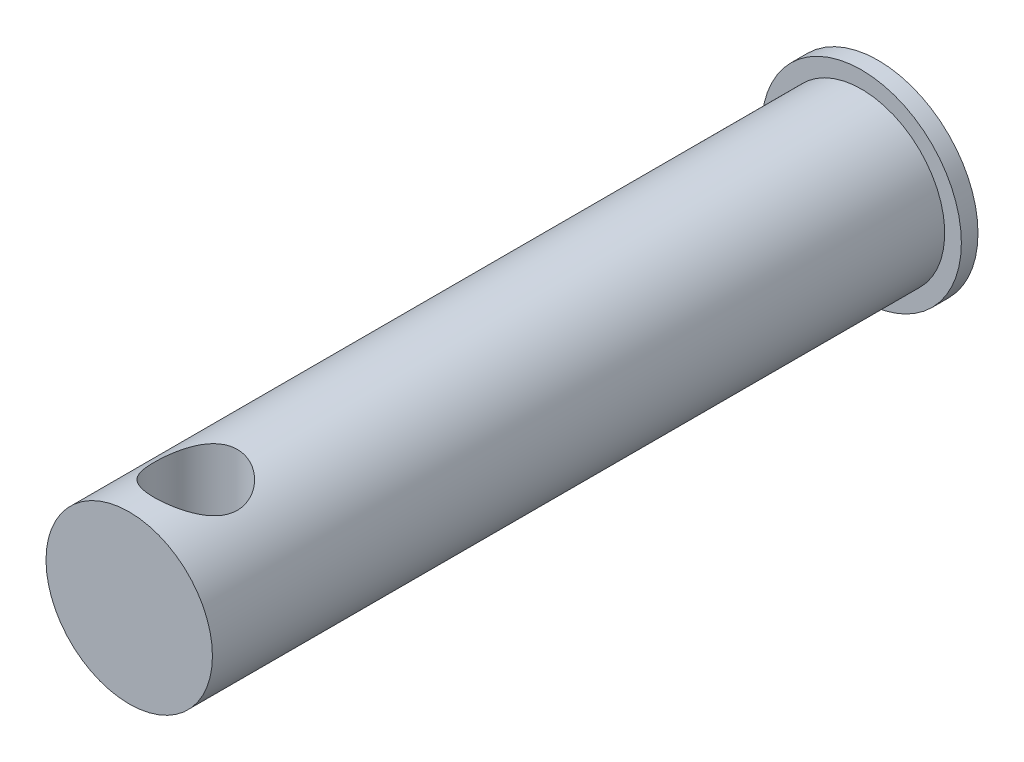
ISO-10303-21;
HEADER;
FILE_DESCRIPTION(('STEP AP214'),'2;1');
FILE_NAME('part.step','',(''),(''),'','','');
FILE_SCHEMA(('AUTOMOTIVE_DESIGN { 1 0 10303 214 1 1 1 1 }'));
ENDSEC;
DATA;
#1=APPLICATION_CONTEXT('core data for automotive mechanical design processes');
#2=APPLICATION_PROTOCOL_DEFINITION('international standard','automotive_design',2000,#1);
#3=PRODUCT_CONTEXT('',#1,'mechanical');
#4=PRODUCT('Part','Part','',(#3));
#5=PRODUCT_RELATED_PRODUCT_CATEGORY('part','',(#4));
#6=PRODUCT_DEFINITION_FORMATION('','',#4);
#7=PRODUCT_DEFINITION_CONTEXT('part definition',#1,'design');
#8=PRODUCT_DEFINITION('design','',#6,#7);
#9=PRODUCT_DEFINITION_SHAPE('','',#8);
#10=(LENGTH_UNIT() NAMED_UNIT(*) SI_UNIT(.MILLI.,.METRE.));
#11=(NAMED_UNIT(*) PLANE_ANGLE_UNIT() SI_UNIT($,.RADIAN.));
#12=(NAMED_UNIT(*) SI_UNIT($,.STERADIAN.) SOLID_ANGLE_UNIT());
#13=UNCERTAINTY_MEASURE_WITH_UNIT(LENGTH_MEASURE(1.E-05),#10,'distance_accuracy_value','');
#14=(GEOMETRIC_REPRESENTATION_CONTEXT(3) GLOBAL_UNCERTAINTY_ASSIGNED_CONTEXT((#13)) GLOBAL_UNIT_ASSIGNED_CONTEXT((#10,
#11,#12)) REPRESENTATION_CONTEXT('',''));
#15=CARTESIAN_POINT('',(0.,0.,0.));
#16=DIRECTION('',(0.,0.,1.));
#17=DIRECTION('',(1.,0.,0.));
#18=AXIS2_PLACEMENT_3D('',#15,#16,#17);
#19=CARTESIAN_POINT('',(0.,0.,5.715));
#20=DIRECTION('',(0.,0.,-1.));
#21=DIRECTION('',(-1.,0.,0.));
#22=AXIS2_PLACEMENT_3D('',#19,#20,#21);
#23=CYLINDRICAL_SURFACE('',#22,1.27);
#24=CARTESIAN_POINT('',(0.,0.,5.715));
#25=DIRECTION('',(0.,0.,1.));
#26=DIRECTION('',(1.,0.,0.));
#27=AXIS2_PLACEMENT_3D('',#24,#25,#26);
#28=CIRCLE('',#27,1.27);
#29=CARTESIAN_POINT('',(1.27,0.,5.715));
#30=VERTEX_POINT('',#29);
#31=EDGE_CURVE('E41',#30,#30,#28,.T.);
#32=ORIENTED_EDGE('',*,*,#31,.F.);
#33=EDGE_LOOP('',(#32));
#34=FACE_BOUND('',#33,.T.);
#35=CARTESIAN_POINT('',(0.,1.27,5.334));
#36=CARTESIAN_POINT('',(-0.0333831964751464,1.26999818011636,5.33399790302712));
#37=CARTESIAN_POINT('',(-0.0668061908082507,1.26866961797394,5.33135200356774));
#38=CARTESIAN_POINT('',(-0.13266434939545,1.26348589083747,5.32088542098352));
#39=CARTESIAN_POINT('',(-0.165097515063075,1.25962592771405,5.31305491044649));
#40=CARTESIAN_POINT('',(-0.227922800999165,1.24978337421103,5.29260193152834));
#41=CARTESIAN_POINT('',(-0.25832231986638,1.24380903877725,5.27999808600251));
#42=CARTESIAN_POINT('',(-0.316530111672169,1.23028568087519,5.25045265543326));
#43=CARTESIAN_POINT('',(-0.344338588683682,1.22273678257291,5.23351141240198));
#44=CARTESIAN_POINT('',(-0.398467464278819,1.20622223993866,5.19460654657684));
#45=CARTESIAN_POINT('',(-0.424596059062541,1.19719851445985,5.17240108568283));
#46=CARTESIAN_POINT('',(-0.472934947490531,1.17894081106683,5.12411886067813));
#47=CARTESIAN_POINT('',(-0.495142255272797,1.16970667892737,5.0980391741245));
#48=CARTESIAN_POINT('',(-0.536735020285927,1.15124834010315,5.04032307305265));
#49=CARTESIAN_POINT('',(-0.55576808807529,1.14208043726034,5.00841257755035));
#50=CARTESIAN_POINT('',(-0.588116824075592,1.12576596520424,4.94133674164875));
#51=CARTESIAN_POINT('',(-0.601436576503622,1.11861795330438,4.90617374826105));
#52=CARTESIAN_POINT('',(-0.621114100789754,1.10780745569008,4.83573765805708));
#53=CARTESIAN_POINT('',(-0.627840919246081,1.10396192455658,4.8005971729372));
#54=CARTESIAN_POINT('',(-0.635271140751118,1.09970500117315,4.72949343801003));
#55=CARTESIAN_POINT('',(-0.635980496116903,1.09929021532988,4.69353103654681));
#56=CARTESIAN_POINT('',(-0.631626427354407,1.10179440713353,4.62642837455974));
#57=CARTESIAN_POINT('',(-0.627243195305882,1.10432064925379,4.59522574017336));
#58=CARTESIAN_POINT('',(-0.614006804151152,1.11173405245995,4.53407658754812));
#59=CARTESIAN_POINT('',(-0.605152221175009,1.11662196558178,4.50413047273112));
#60=CARTESIAN_POINT('',(-0.583063210545113,1.12831547522091,4.44548950082081));
#61=CARTESIAN_POINT('',(-0.569731567618657,1.13516308821639,4.41684003677102));
#62=CARTESIAN_POINT('',(-0.539141471669182,1.15000661718691,4.36204722420534));
#63=CARTESIAN_POINT('',(-0.521881254820917,1.15800304835421,4.33590500889394));
#64=CARTESIAN_POINT('',(-0.481371944869621,1.17546855268586,4.28337900450805));
#65=CARTESIAN_POINT('',(-0.457640981064494,1.18499579000334,4.25738488527914));
#66=CARTESIAN_POINT('',(-0.406117792500773,1.20362740795759,4.20958300919478));
#67=CARTESIAN_POINT('',(-0.378323637924672,1.21273158493839,4.18777725305848));
#68=CARTESIAN_POINT('',(-0.317827981203224,1.23000761924682,4.14801960524612));
#69=CARTESIAN_POINT('',(-0.284958530665625,1.23811654942875,4.13029369999695));
#70=CARTESIAN_POINT('',(-0.216196046835387,1.25195254511989,4.10076838655769));
#71=CARTESIAN_POINT('',(-0.180305440928451,1.25768150129156,4.08896427251537));
#72=CARTESIAN_POINT('',(-0.109706722204546,1.26570951925812,4.07258811863991));
#73=CARTESIAN_POINT('',(-0.0751468718981862,1.26825335821333,4.0674980653008));
#74=CARTESIAN_POINT('',(-0.00557504596783976,1.2704636354653,4.0630698957296));
#75=CARTESIAN_POINT('',(0.0294367076173873,1.27013143688033,4.06372905461893));
#76=CARTESIAN_POINT('',(0.096032937211106,1.26676907080935,4.07048124714591));
#77=CARTESIAN_POINT('',(0.127672724111721,1.26395001012,4.07614915828357));
#78=CARTESIAN_POINT('',(0.189488376611717,1.2561707878491,4.09209117565338));
#79=CARTESIAN_POINT('',(0.219664080413783,1.25121039022301,4.10236578969788));
#80=CARTESIAN_POINT('',(0.278694266365538,1.2394199964768,4.12749902618506));
#81=CARTESIAN_POINT('',(0.307486302098908,1.23254059923911,4.14248031682417));
#82=CARTESIAN_POINT('',(0.362242964678815,1.21757423691364,4.17646328513524));
#83=CARTESIAN_POINT('',(0.388206379907304,1.20948675784274,4.19546667546683));
#84=CARTESIAN_POINT('',(0.439272482699565,1.1919472054929,4.23910787008637));
#85=CARTESIAN_POINT('',(0.464040269418646,1.1824391187876,4.26411572146801));
#86=CARTESIAN_POINT('',(0.509178763906908,1.1637161866846,4.31795247105601));
#87=CARTESIAN_POINT('',(0.529546429913685,1.15450154787269,4.3467839904484));
#88=CARTESIAN_POINT('',(0.566234525706037,1.13697507063553,4.4092137204172));
#89=CARTESIAN_POINT('',(0.582311189882935,1.12872856336305,4.44297515404246));
#90=CARTESIAN_POINT('',(0.608382594518765,1.1148953595376,4.51326889298475));
#91=CARTESIAN_POINT('',(0.618385171588607,1.10930523782792,4.54979755932825));
#92=CARTESIAN_POINT('',(0.631102171530546,1.10211553140503,4.62083799151702));
#93=CARTESIAN_POINT('',(0.634424052714549,1.10018438497412,4.65520675092744));
#94=CARTESIAN_POINT('',(0.6354376130318,1.09960000200321,4.72404888765341));
#95=CARTESIAN_POINT('',(0.633131732606494,1.10094534463496,4.75852221314954));
#96=CARTESIAN_POINT('',(0.623523089751088,1.10641042401766,4.82313202347283));
#97=CARTESIAN_POINT('',(0.616717279607678,1.1102536499632,4.85336879854169));
#98=CARTESIAN_POINT('',(0.59891635247265,1.11995595279328,4.91223815583469));
#99=CARTESIAN_POINT('',(0.58791988788648,1.12581567806744,4.9408702186284));
#100=CARTESIAN_POINT('',(0.561222998265935,1.13937116781475,4.99784678037649));
#101=CARTESIAN_POINT('',(0.545256172513452,1.14716383721581,5.02604271766186));
#102=CARTESIAN_POINT('',(0.509365866989263,1.16354435587965,5.07953933047467));
#103=CARTESIAN_POINT('',(0.489440328736542,1.17213261759521,5.10483848887924));
#104=CARTESIAN_POINT('',(0.443359112432048,1.19038575206164,5.15502015879709));
#105=CARTESIAN_POINT('',(0.416740608611459,1.20005464402783,5.17947852999982));
#106=CARTESIAN_POINT('',(0.359508301949878,1.21842372681981,5.22367699447401));
#107=CARTESIAN_POINT('',(0.328892359268059,1.22712339416105,5.24341454453569));
#108=CARTESIAN_POINT('',(0.264116563980667,1.24268236086541,5.277635090354));
#109=CARTESIAN_POINT('',(0.229933184998481,1.24952821317447,5.29207994757626));
#110=CARTESIAN_POINT('',(0.159221234321812,1.26048351765801,5.31482818662854));
#111=CARTESIAN_POINT('',(0.122699652760711,1.26460074341812,5.32314902273678));
#112=CARTESIAN_POINT('',(0.0715022360169488,1.26806618312636,5.33012485603316));
#113=CARTESIAN_POINT('',(0.0572527934440815,1.26878946990393,5.3315759769484));
#114=CARTESIAN_POINT('',(0.0286713496975449,1.26975677580944,5.33351401260317));
#115=CARTESIAN_POINT('',(0.0143393462560871,1.2700007817089,5.33400090072921));
#116=CARTESIAN_POINT('',(0.,1.27,5.334));
#117=B_SPLINE_CURVE_WITH_KNOTS('',3,(#35,#36,#37,#38,#39,#40,#41,#42,#43,#44,#45,#46,#47,#48,
#49,#50,#51,#52,#53,#54,#55,#56,#57,#58,#59,#60,#61,#62,#63,#64,#65,#66,#67,#68,#69,#70,#71,#72,
#73,#74,#75,#76,#77,#78,#79,#80,#81,#82,#83,#84,#85,#86,#87,#88,#89,#90,#91,#92,#93,#94,#95,#96,
#97,#98,#99,#100,#101,#102,#103,#104,#105,#106,#107,#108,#109,#110,#111,#112,#113,#114,#115,
#116),.UNSPECIFIED.,.T.,.F.,(4,2,2,2,2,2,2,2,2,2,2,2,2,2,2,2,2,2,2,2,2,2,2,2,2,2,2,2,2,2,2,2,2,
2,2,2,2,2,2,2,4),(0.,0.100091403461886,0.200373075065341,0.30026746873761,0.400153987969296,
0.506083416785987,0.612093160910313,0.726323962835281,0.840472969154084,0.94778837709046,
1.05499761903928,1.14938627379919,1.24380500492806,1.3404230250699,1.43708451000241,
1.54600237747013,1.65497214470166,1.7690021910617,1.88294147739298,1.98744389449305,
2.09189678464787,2.18825385631388,2.28462155235642,2.38374463577716,2.48291001225196,
2.59181352759206,2.70079208770799,2.81504823171393,2.92915665082394,3.03231110261467,
3.13542083011104,3.22870785705056,3.32202490777636,3.42161150052515,3.52125001323238,
3.63299529147837,3.74480063444124,3.85739648675958,3.96967016976831,4.01266202887438,
4.05565507456928),.UNSPECIFIED.);
#118=CARTESIAN_POINT('',(0.,1.27,5.334));
#119=VERTEX_POINT('',#118);
#120=EDGE_CURVE('E50',#119,#119,#117,.T.);
#121=ORIENTED_EDGE('',*,*,#120,.T.);
#122=EDGE_LOOP('',(#121));
#123=FACE_BOUND('',#122,.T.);
#124=CARTESIAN_POINT('',(0.,-1.27,5.334));
#125=CARTESIAN_POINT('',(0.0333831964751464,-1.26999818011636,5.33399790302712));
#126=CARTESIAN_POINT('',(0.0668061908082507,-1.26866961797394,5.33135200356774));
#127=CARTESIAN_POINT('',(0.13266434939545,-1.26348589083747,5.32088542098352));
#128=CARTESIAN_POINT('',(0.165097515063075,-1.25962592771405,5.31305491044649));
#129=CARTESIAN_POINT('',(0.227922800999165,-1.24978337421103,5.29260193152834));
#130=CARTESIAN_POINT('',(0.25832231986638,-1.24380903877725,5.27999808600251));
#131=CARTESIAN_POINT('',(0.316530111672169,-1.23028568087519,5.25045265543326));
#132=CARTESIAN_POINT('',(0.344338588683682,-1.22273678257292,5.23351141240198));
#133=CARTESIAN_POINT('',(0.398467464278819,-1.20622223993866,5.19460654657684));
#134=CARTESIAN_POINT('',(0.424596059062541,-1.19719851445985,5.17240108568283));
#135=CARTESIAN_POINT('',(0.472934947490531,-1.17894081106683,5.12411886067813));
#136=CARTESIAN_POINT('',(0.495142255272797,-1.16970667892737,5.0980391741245));
#137=CARTESIAN_POINT('',(0.536735020285927,-1.15124834010315,5.04032307305265));
#138=CARTESIAN_POINT('',(0.55576808807529,-1.14208043726034,5.00841257755035));
#139=CARTESIAN_POINT('',(0.588116824075592,-1.12576596520424,4.94133674164875));
#140=CARTESIAN_POINT('',(0.601436576503622,-1.11861795330438,4.90617374826105));
#141=CARTESIAN_POINT('',(0.621114100789754,-1.10780745569008,4.83573765805708));
#142=CARTESIAN_POINT('',(0.627840919246081,-1.10396192455658,4.8005971729372));
#143=CARTESIAN_POINT('',(0.635271140751118,-1.09970500117315,4.72949343801003));
#144=CARTESIAN_POINT('',(0.635980496116903,-1.09929021532988,4.69353103654682));
#145=CARTESIAN_POINT('',(0.631626427354407,-1.10179440713353,4.62642837455974));
#146=CARTESIAN_POINT('',(0.627243195305882,-1.10432064925379,4.59522574017336));
#147=CARTESIAN_POINT('',(0.614006804151153,-1.11173405245995,4.53407658754812));
#148=CARTESIAN_POINT('',(0.605152221175009,-1.11662196558178,4.50413047273112));
#149=CARTESIAN_POINT('',(0.583063210545113,-1.12831547522091,4.44548950082081));
#150=CARTESIAN_POINT('',(0.569731567618657,-1.13516308821639,4.41684003677102));
#151=CARTESIAN_POINT('',(0.539141471669182,-1.15000661718691,4.36204722420534));
#152=CARTESIAN_POINT('',(0.521881254820917,-1.15800304835421,4.33590500889394));
#153=CARTESIAN_POINT('',(0.481371944869621,-1.17546855268586,4.28337900450805));
#154=CARTESIAN_POINT('',(0.457640981064494,-1.18499579000334,4.25738488527914));
#155=CARTESIAN_POINT('',(0.406117792500773,-1.20362740795759,4.20958300919478));
#156=CARTESIAN_POINT('',(0.378323637924672,-1.21273158493839,4.18777725305848));
#157=CARTESIAN_POINT('',(0.317827981203224,-1.23000761924682,4.14801960524612));
#158=CARTESIAN_POINT('',(0.284958530665625,-1.23811654942875,4.13029369999695));
#159=CARTESIAN_POINT('',(0.216196046835387,-1.25195254511989,4.10076838655769));
#160=CARTESIAN_POINT('',(0.180305440928451,-1.25768150129156,4.08896427251537));
#161=CARTESIAN_POINT('',(0.109706722204546,-1.26570951925812,4.07258811863991));
#162=CARTESIAN_POINT('',(0.0751468718981861,-1.26825335821333,4.0674980653008));
#163=CARTESIAN_POINT('',(0.0055750459678397,-1.2704636354653,4.0630698957296));
#164=CARTESIAN_POINT('',(-0.0294367076173873,-1.27013143688033,4.06372905461893));
#165=CARTESIAN_POINT('',(-0.096032937211106,-1.26676907080935,4.07048124714591));
#166=CARTESIAN_POINT('',(-0.127672724111721,-1.26395001012,4.07614915828357));
#167=CARTESIAN_POINT('',(-0.189488376611717,-1.2561707878491,4.09209117565338));
#168=CARTESIAN_POINT('',(-0.219664080413783,-1.25121039022301,4.10236578969788));
#169=CARTESIAN_POINT('',(-0.278694266365537,-1.2394199964768,4.12749902618506));
#170=CARTESIAN_POINT('',(-0.307486302098907,-1.23254059923911,4.14248031682417));
#171=CARTESIAN_POINT('',(-0.362242964678815,-1.21757423691364,4.17646328513524));
#172=CARTESIAN_POINT('',(-0.388206379907304,-1.20948675784274,4.19546667546683));
#173=CARTESIAN_POINT('',(-0.439272482699565,-1.1919472054929,4.23910787008637));
#174=CARTESIAN_POINT('',(-0.464040269418646,-1.1824391187876,4.26411572146801));
#175=CARTESIAN_POINT('',(-0.509178763906908,-1.1637161866846,4.31795247105601));
#176=CARTESIAN_POINT('',(-0.529546429913685,-1.15450154787269,4.3467839904484));
#177=CARTESIAN_POINT('',(-0.566234525706037,-1.13697507063553,4.4092137204172));
#178=CARTESIAN_POINT('',(-0.582311189882935,-1.12872856336305,4.44297515404246));
#179=CARTESIAN_POINT('',(-0.608382594518765,-1.1148953595376,4.51326889298475));
#180=CARTESIAN_POINT('',(-0.618385171588607,-1.10930523782792,4.54979755932825));
#181=CARTESIAN_POINT('',(-0.631102171530546,-1.10211553140503,4.62083799151702));
#182=CARTESIAN_POINT('',(-0.634424052714549,-1.10018438497412,4.65520675092744));
#183=CARTESIAN_POINT('',(-0.6354376130318,-1.09960000200321,4.72404888765341));
#184=CARTESIAN_POINT('',(-0.633131732606494,-1.10094534463496,4.75852221314954));
#185=CARTESIAN_POINT('',(-0.623523089751088,-1.10641042401766,4.82313202347283));
#186=CARTESIAN_POINT('',(-0.616717279607678,-1.1102536499632,4.85336879854169));
#187=CARTESIAN_POINT('',(-0.59891635247265,-1.11995595279328,4.91223815583469));
#188=CARTESIAN_POINT('',(-0.58791988788648,-1.12581567806744,4.9408702186284));
#189=CARTESIAN_POINT('',(-0.561222998265935,-1.13937116781475,4.99784678037649));
#190=CARTESIAN_POINT('',(-0.545256172513452,-1.14716383721581,5.02604271766186));
#191=CARTESIAN_POINT('',(-0.509365866989263,-1.16354435587965,5.07953933047467));
#192=CARTESIAN_POINT('',(-0.489440328736542,-1.17213261759521,5.10483848887924));
#193=CARTESIAN_POINT('',(-0.443359112432048,-1.19038575206164,5.15502015879709));
#194=CARTESIAN_POINT('',(-0.416740608611459,-1.20005464402783,5.17947852999982));
#195=CARTESIAN_POINT('',(-0.359508301949878,-1.21842372681981,5.22367699447401));
#196=CARTESIAN_POINT('',(-0.328892359268059,-1.22712339416105,5.24341454453569));
#197=CARTESIAN_POINT('',(-0.264116563980667,-1.24268236086541,5.277635090354));
#198=CARTESIAN_POINT('',(-0.229933184998481,-1.24952821317447,5.29207994757626));
#199=CARTESIAN_POINT('',(-0.159221234321812,-1.26048351765801,5.31482818662854));
#200=CARTESIAN_POINT('',(-0.122699652760711,-1.26460074341812,5.32314902273678));
#201=CARTESIAN_POINT('',(-0.0715022360169488,-1.26806618312636,5.33012485603316));
#202=CARTESIAN_POINT('',(-0.0572527934440819,-1.26878946990393,5.3315759769484));
#203=CARTESIAN_POINT('',(-0.0286713496975454,-1.26975677580944,5.33351401260317));
#204=CARTESIAN_POINT('',(-0.0143393462560873,-1.2700007817089,5.33400090072921));
#205=CARTESIAN_POINT('',(0.,-1.27,5.334));
#206=B_SPLINE_CURVE_WITH_KNOTS('',3,(#124,#125,#126,#127,#128,#129,#130,#131,#132,#133,#134,
#135,#136,#137,#138,#139,#140,#141,#142,#143,#144,#145,#146,#147,#148,#149,#150,#151,#152,#153,
#154,#155,#156,#157,#158,#159,#160,#161,#162,#163,#164,#165,#166,#167,#168,#169,#170,#171,#172,
#173,#174,#175,#176,#177,#178,#179,#180,#181,#182,#183,#184,#185,#186,#187,#188,#189,#190,#191,
#192,#193,#194,#195,#196,#197,#198,#199,#200,#201,#202,#203,#204,#205),.UNSPECIFIED.,.T.,.F.,(4,
2,2,2,2,2,2,2,2,2,2,2,2,2,2,2,2,2,2,2,2,2,2,2,2,2,2,2,2,2,2,2,2,2,2,2,2,2,2,2,4),(0.,
0.100091403461886,0.200373075065341,0.30026746873761,0.400153987969295,0.506083416785986,
0.612093160910313,0.72632396283528,0.840472969154084,0.947788377090458,1.05499761903928,
1.14938627379919,1.24380500492806,1.3404230250699,1.43708451000241,1.54600237747013,
1.65497214470166,1.7690021910617,1.88294147739298,1.98744389449305,2.09189678464787,
2.18825385631388,2.28462155235642,2.38374463577716,2.48291001225196,2.59181352759206,
2.70079208770799,2.81504823171393,2.92915665082394,3.03231110261467,3.13542083011104,
3.22870785705056,3.32202490777636,3.42161150052515,3.52125001323238,3.63299529147837,
3.74480063444124,3.85739648675958,3.96967016976831,4.01266202887438,4.05565507456928),.UNSPECIFIED.);
#207=CARTESIAN_POINT('',(0.,-1.27,5.334));
#208=VERTEX_POINT('',#207);
#209=EDGE_CURVE('E45',#208,#208,#206,.T.);
#210=ORIENTED_EDGE('',*,*,#209,.T.);
#211=EDGE_LOOP('',(#210));
#212=FACE_BOUND('',#211,.T.);
#213=CARTESIAN_POINT('',(0.,0.,-5.461));
#214=DIRECTION('',(0.,0.,-1.));
#215=DIRECTION('',(-1.,0.,0.));
#216=AXIS2_PLACEMENT_3D('',#213,#214,#215);
#217=CIRCLE('',#216,1.27);
#218=CARTESIAN_POINT('',(-1.27,0.,-5.461));
#219=VERTEX_POINT('',#218);
#220=EDGE_CURVE('E10',#219,#219,#217,.T.);
#221=ORIENTED_EDGE('',*,*,#220,.F.);
#222=EDGE_LOOP('',(#221));
#223=FACE_BOUND('',#222,.T.);
#224=ADVANCED_FACE('F34',(#34,#123,#212,#223),#23,.T.);
#225=CARTESIAN_POINT('',(0.,0.,5.715));
#226=DIRECTION('',(0.,0.,1.));
#227=DIRECTION('',(1.,0.,0.));
#228=AXIS2_PLACEMENT_3D('',#225,#226,#227);
#229=PLANE('',#228);
#230=ORIENTED_EDGE('',*,*,#31,.T.);
#231=EDGE_LOOP('',(#230));
#232=FACE_BOUND('',#231,.T.);
#233=ADVANCED_FACE('F70',(#232),#229,.T.);
#234=CARTESIAN_POINT('',(0.,-1.524,4.699));
#235=DIRECTION('',(0.,1.,0.));
#236=DIRECTION('',(0.,0.,1.));
#237=AXIS2_PLACEMENT_3D('',#234,#235,#236);
#238=CYLINDRICAL_SURFACE('',#237,0.635);
#239=ORIENTED_EDGE('',*,*,#120,.F.);
#240=EDGE_LOOP('',(#239));
#241=FACE_BOUND('',#240,.T.);
#242=ORIENTED_EDGE('',*,*,#209,.F.);
#243=EDGE_LOOP('',(#242));
#244=FACE_BOUND('',#243,.T.);
#245=ADVANCED_FACE('F64',(#241,#244),#238,.F.);
#246=CARTESIAN_POINT('',(0.,0.,-5.461));
#247=DIRECTION('',(0.,0.,-1.));
#248=DIRECTION('',(-1.,0.,0.));
#249=AXIS2_PLACEMENT_3D('',#246,#247,#248);
#250=CYLINDRICAL_SURFACE('',#249,1.524);
#251=CARTESIAN_POINT('',(0.,0.,-5.461));
#252=DIRECTION('',(0.,0.,-1.));
#253=DIRECTION('',(-1.,0.,0.));
#254=AXIS2_PLACEMENT_3D('',#251,#252,#253);
#255=CIRCLE('',#254,1.524);
#256=CARTESIAN_POINT('',(-1.524,0.,-5.461));
#257=VERTEX_POINT('',#256);
#258=EDGE_CURVE('E60',#257,#257,#255,.T.);
#259=ORIENTED_EDGE('',*,*,#258,.T.);
#260=EDGE_LOOP('',(#259));
#261=FACE_BOUND('',#260,.T.);
#262=CARTESIAN_POINT('',(0.,0.,-5.715));
#263=DIRECTION('',(0.,0.,-1.));
#264=DIRECTION('',(-1.,0.,0.));
#265=AXIS2_PLACEMENT_3D('',#262,#263,#264);
#266=CIRCLE('',#265,1.524);
#267=CARTESIAN_POINT('',(-1.524,0.,-5.715));
#268=VERTEX_POINT('',#267);
#269=EDGE_CURVE('E53',#268,#268,#266,.T.);
#270=ORIENTED_EDGE('',*,*,#269,.F.);
#271=EDGE_LOOP('',(#270));
#272=FACE_BOUND('',#271,.T.);
#273=ADVANCED_FACE('F69',(#261,#272),#250,.T.);
#274=CARTESIAN_POINT('',(0.,0.,-5.461));
#275=DIRECTION('',(0.,0.,-1.));
#276=DIRECTION('',(-1.,0.,0.));
#277=AXIS2_PLACEMENT_3D('',#274,#275,#276);
#278=PLANE('',#277);
#279=ORIENTED_EDGE('',*,*,#220,.T.);
#280=EDGE_LOOP('',(#279));
#281=FACE_BOUND('',#280,.T.);
#282=ORIENTED_EDGE('',*,*,#258,.F.);
#283=EDGE_LOOP('',(#282));
#284=FACE_BOUND('',#283,.T.);
#285=ADVANCED_FACE('F77',(#281,#284),#278,.F.);
#286=CARTESIAN_POINT('',(0.,0.,-5.715));
#287=DIRECTION('',(0.,0.,1.));
#288=DIRECTION('',(1.,0.,0.));
#289=AXIS2_PLACEMENT_3D('',#286,#287,#288);
#290=PLANE('',#289);
#291=ORIENTED_EDGE('',*,*,#269,.T.);
#292=EDGE_LOOP('',(#291));
#293=FACE_BOUND('',#292,.T.);
#294=ADVANCED_FACE('F75',(#293),#290,.F.);
#295=CLOSED_SHELL('',(#224,#233,#245,#273,#285,#294));
#296=MANIFOLD_SOLID_BREP('B2',#295);
#297=ADVANCED_BREP_SHAPE_REPRESENTATION('',(#18,#296),#14);
#298=SHAPE_DEFINITION_REPRESENTATION(#9,#297);
ENDSEC;
END-ISO-10303-21;
